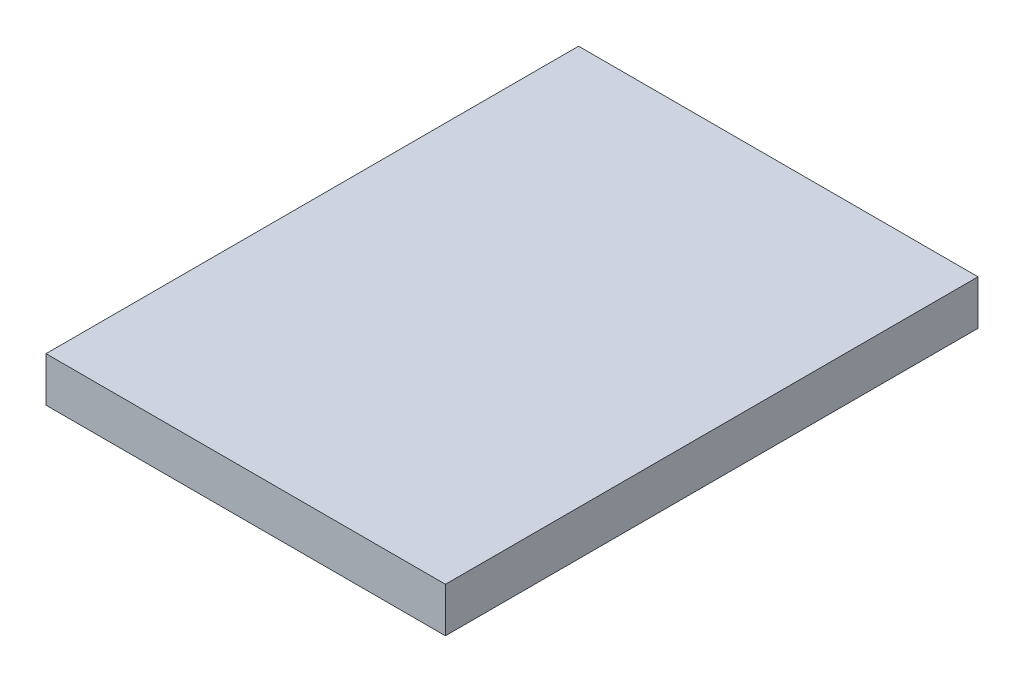
ISO-10303-21;
HEADER;
FILE_DESCRIPTION(('STEP AP214'),'2;1');
FILE_NAME('part.step','',(''),(''),'','','');
FILE_SCHEMA(('AUTOMOTIVE_DESIGN { 1 0 10303 214 1 1 1 1 }'));
ENDSEC;
DATA;
#1=APPLICATION_CONTEXT('core data for automotive mechanical design processes');
#2=APPLICATION_PROTOCOL_DEFINITION('international standard','automotive_design',2000,#1);
#3=PRODUCT_CONTEXT('',#1,'mechanical');
#4=PRODUCT('Part','Part','',(#3));
#5=PRODUCT_RELATED_PRODUCT_CATEGORY('part','',(#4));
#6=PRODUCT_DEFINITION_FORMATION('','',#4);
#7=PRODUCT_DEFINITION_CONTEXT('part definition',#1,'design');
#8=PRODUCT_DEFINITION('design','',#6,#7);
#9=PRODUCT_DEFINITION_SHAPE('','',#8);
#10=(LENGTH_UNIT() NAMED_UNIT(*) SI_UNIT(.MILLI.,.METRE.));
#11=(NAMED_UNIT(*) PLANE_ANGLE_UNIT() SI_UNIT($,.RADIAN.));
#12=(NAMED_UNIT(*) SI_UNIT($,.STERADIAN.) SOLID_ANGLE_UNIT());
#13=UNCERTAINTY_MEASURE_WITH_UNIT(LENGTH_MEASURE(1.E-05),#10,'distance_accuracy_value','');
#14=(GEOMETRIC_REPRESENTATION_CONTEXT(3) GLOBAL_UNCERTAINTY_ASSIGNED_CONTEXT((#13)) GLOBAL_UNIT_ASSIGNED_CONTEXT((#10,
#11,#12)) REPRESENTATION_CONTEXT('',''));
#15=CARTESIAN_POINT('',(0.,0.,0.));
#16=DIRECTION('',(0.,0.,1.));
#17=DIRECTION('',(1.,0.,0.));
#18=AXIS2_PLACEMENT_3D('',#15,#16,#17);
#19=CARTESIAN_POINT('',(0.,5.7,0.));
#20=DIRECTION('',(1.,0.,0.));
#21=DIRECTION('',(0.,0.,-1.));
#22=AXIS2_PLACEMENT_3D('',#19,#20,#21);
#23=PLANE('',#22);
#24=DIRECTION('',(0.,0.,1.));
#25=VECTOR('',#24,1.);
#26=CARTESIAN_POINT('',(0.,0.,0.));
#27=LINE('',#26,#25);
#28=CARTESIAN_POINT('',(0.,0.,-68.));
#29=VERTEX_POINT('',#28);
#30=CARTESIAN_POINT('',(0.,0.,0.));
#31=VERTEX_POINT('',#30);
#32=EDGE_CURVE('E107',#29,#31,#27,.T.);
#33=ORIENTED_EDGE('',*,*,#32,.T.);
#34=DIRECTION('',(0.,-1.,0.));
#35=VECTOR('',#34,1.);
#36=CARTESIAN_POINT('',(0.,5.7,0.));
#37=LINE('',#36,#35);
#38=CARTESIAN_POINT('',(0.,5.7,0.));
#39=VERTEX_POINT('',#38);
#40=EDGE_CURVE('E11',#39,#31,#37,.T.);
#41=ORIENTED_EDGE('',*,*,#40,.F.);
#42=DIRECTION('',(0.,0.,1.));
#43=VECTOR('',#42,1.);
#44=CARTESIAN_POINT('',(0.,5.7,0.));
#45=LINE('',#44,#43);
#46=CARTESIAN_POINT('',(0.,5.7,-68.));
#47=VERTEX_POINT('',#46);
#48=EDGE_CURVE('E91',#47,#39,#45,.T.);
#49=ORIENTED_EDGE('',*,*,#48,.F.);
#50=DIRECTION('',(0.,-1.,0.));
#51=VECTOR('',#50,1.);
#52=CARTESIAN_POINT('',(0.,5.7,-68.));
#53=LINE('',#52,#51);
#54=EDGE_CURVE('E103',#47,#29,#53,.T.);
#55=ORIENTED_EDGE('',*,*,#54,.T.);
#56=EDGE_LOOP('',(#33,#41,#49,#55));
#57=FACE_BOUND('',#56,.T.);
#58=ADVANCED_FACE('F39',(#57),#23,.F.);
#59=CARTESIAN_POINT('',(0.,5.7,0.));
#60=DIRECTION('',(0.,0.,-1.));
#61=DIRECTION('',(-1.,0.,0.));
#62=AXIS2_PLACEMENT_3D('',#59,#60,#61);
#63=PLANE('',#62);
#64=DIRECTION('',(1.,0.,0.));
#65=VECTOR('',#64,1.);
#66=CARTESIAN_POINT('',(0.,0.,0.));
#67=LINE('',#66,#65);
#68=CARTESIAN_POINT('',(51.,0.,0.));
#69=VERTEX_POINT('',#68);
#70=EDGE_CURVE('E96',#31,#69,#67,.T.);
#71=ORIENTED_EDGE('',*,*,#70,.T.);
#72=DIRECTION('',(0.,-1.,0.));
#73=VECTOR('',#72,1.);
#74=CARTESIAN_POINT('',(51.,5.7,0.));
#75=LINE('',#74,#73);
#76=CARTESIAN_POINT('',(51.,5.7,0.));
#77=VERTEX_POINT('',#76);
#78=EDGE_CURVE('E48',#77,#69,#75,.T.);
#79=ORIENTED_EDGE('',*,*,#78,.F.);
#80=DIRECTION('',(1.,0.,0.));
#81=VECTOR('',#80,1.);
#82=CARTESIAN_POINT('',(0.,5.7,0.));
#83=LINE('',#82,#81);
#84=EDGE_CURVE('E86',#39,#77,#83,.T.);
#85=ORIENTED_EDGE('',*,*,#84,.F.);
#86=ORIENTED_EDGE('',*,*,#40,.T.);
#87=EDGE_LOOP('',(#71,#79,#85,#86));
#88=FACE_BOUND('',#87,.T.);
#89=ADVANCED_FACE('F95',(#88),#63,.F.);
#90=CARTESIAN_POINT('',(51.,5.7,0.));
#91=DIRECTION('',(-1.,0.,0.));
#92=DIRECTION('',(0.,0.,1.));
#93=AXIS2_PLACEMENT_3D('',#90,#91,#92);
#94=PLANE('',#93);
#95=DIRECTION('',(0.,0.,-1.));
#96=VECTOR('',#95,1.);
#97=CARTESIAN_POINT('',(51.,0.,0.));
#98=LINE('',#97,#96);
#99=CARTESIAN_POINT('',(51.,0.,-68.));
#100=VERTEX_POINT('',#99);
#101=EDGE_CURVE('E73',#69,#100,#98,.T.);
#102=ORIENTED_EDGE('',*,*,#101,.T.);
#103=DIRECTION('',(0.,-1.,0.));
#104=VECTOR('',#103,1.);
#105=CARTESIAN_POINT('',(51.,5.7,-68.));
#106=LINE('',#105,#104);
#107=CARTESIAN_POINT('',(51.,5.7,-68.));
#108=VERTEX_POINT('',#107);
#109=EDGE_CURVE('E98',#108,#100,#106,.T.);
#110=ORIENTED_EDGE('',*,*,#109,.F.);
#111=DIRECTION('',(0.,0.,-1.));
#112=VECTOR('',#111,1.);
#113=CARTESIAN_POINT('',(51.,5.7,0.));
#114=LINE('',#113,#112);
#115=EDGE_CURVE('E89',#77,#108,#114,.T.);
#116=ORIENTED_EDGE('',*,*,#115,.F.);
#117=ORIENTED_EDGE('',*,*,#78,.T.);
#118=EDGE_LOOP('',(#102,#110,#116,#117));
#119=FACE_BOUND('',#118,.T.);
#120=ADVANCED_FACE('F99',(#119),#94,.F.);
#121=CARTESIAN_POINT('',(0.,5.7,-68.));
#122=DIRECTION('',(0.,0.,1.));
#123=DIRECTION('',(1.,0.,0.));
#124=AXIS2_PLACEMENT_3D('',#121,#122,#123);
#125=PLANE('',#124);
#126=DIRECTION('',(-1.,0.,0.));
#127=VECTOR('',#126,1.);
#128=CARTESIAN_POINT('',(0.,0.,-68.));
#129=LINE('',#128,#127);
#130=EDGE_CURVE('E79',#100,#29,#129,.T.);
#131=ORIENTED_EDGE('',*,*,#130,.T.);
#132=ORIENTED_EDGE('',*,*,#54,.F.);
#133=DIRECTION('',(-1.,0.,0.));
#134=VECTOR('',#133,1.);
#135=CARTESIAN_POINT('',(0.,5.7,-68.));
#136=LINE('',#135,#134);
#137=EDGE_CURVE('E56',#108,#47,#136,.T.);
#138=ORIENTED_EDGE('',*,*,#137,.F.);
#139=ORIENTED_EDGE('',*,*,#109,.T.);
#140=EDGE_LOOP('',(#131,#132,#138,#139));
#141=FACE_BOUND('',#140,.T.);
#142=ADVANCED_FACE('F120',(#141),#125,.F.);
#143=CARTESIAN_POINT('',(0.,5.7,0.));
#144=DIRECTION('',(0.,-1.,0.));
#145=DIRECTION('',(0.,0.,-1.));
#146=AXIS2_PLACEMENT_3D('',#143,#144,#145);
#147=PLANE('',#146);
#148=ORIENTED_EDGE('',*,*,#48,.T.);
#149=ORIENTED_EDGE('',*,*,#84,.T.);
#150=ORIENTED_EDGE('',*,*,#115,.T.);
#151=ORIENTED_EDGE('',*,*,#137,.T.);
#152=EDGE_LOOP('',(#148,#149,#150,#151));
#153=FACE_BOUND('',#152,.T.);
#154=ADVANCED_FACE('F87',(#153),#147,.F.);
#155=CARTESIAN_POINT('',(0.,0.,0.));
#156=DIRECTION('',(0.,-1.,0.));
#157=DIRECTION('',(0.,0.,-1.));
#158=AXIS2_PLACEMENT_3D('',#155,#156,#157);
#159=PLANE('',#158);
#160=ORIENTED_EDGE('',*,*,#32,.F.);
#161=ORIENTED_EDGE('',*,*,#130,.F.);
#162=ORIENTED_EDGE('',*,*,#101,.F.);
#163=ORIENTED_EDGE('',*,*,#70,.F.);
#164=EDGE_LOOP('',(#160,#161,#162,#163));
#165=FACE_BOUND('',#164,.T.);
#166=ADVANCED_FACE('F123',(#165),#159,.T.);
#167=CLOSED_SHELL('',(#58,#89,#120,#142,#154,#166));
#168=MANIFOLD_SOLID_BREP('B2',#167);
#169=ADVANCED_BREP_SHAPE_REPRESENTATION('',(#18,#168),#14);
#170=SHAPE_DEFINITION_REPRESENTATION(#9,#169);
ENDSEC;
END-ISO-10303-21;
